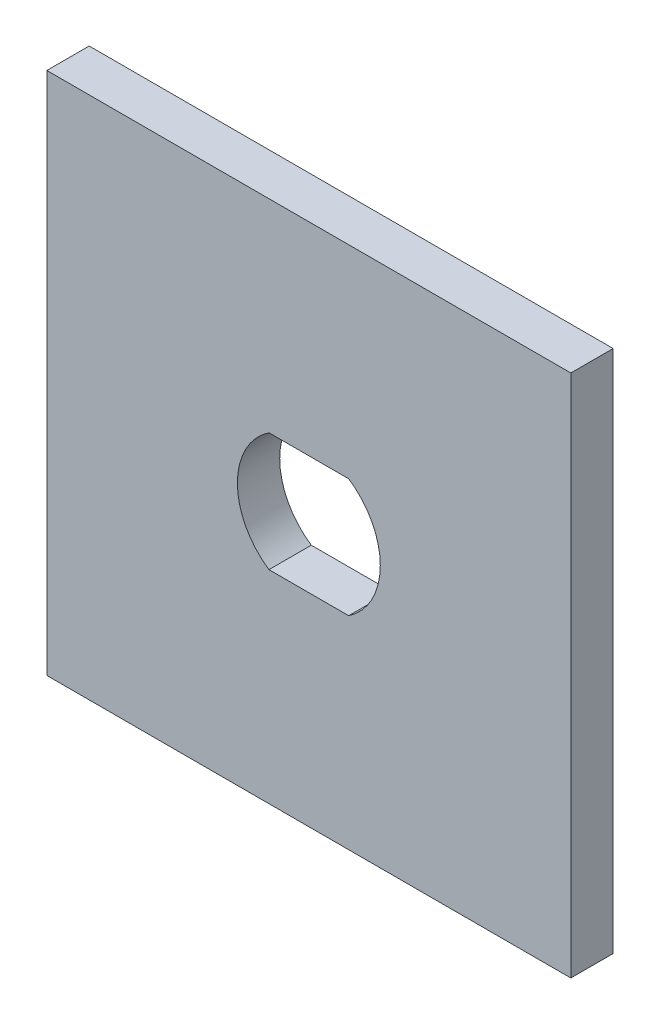
ISO-10303-21;
HEADER;
FILE_DESCRIPTION(('STEP AP214'),'2;1');
FILE_NAME('part.step','',(''),(''),'','','');
FILE_SCHEMA(('AUTOMOTIVE_DESIGN { 1 0 10303 214 1 1 1 1 }'));
ENDSEC;
DATA;
#1=APPLICATION_CONTEXT('core data for automotive mechanical design processes');
#2=APPLICATION_PROTOCOL_DEFINITION('international standard','automotive_design',2000,#1);
#3=PRODUCT_CONTEXT('',#1,'mechanical');
#4=PRODUCT('Part','Part','',(#3));
#5=PRODUCT_RELATED_PRODUCT_CATEGORY('part','',(#4));
#6=PRODUCT_DEFINITION_FORMATION('','',#4);
#7=PRODUCT_DEFINITION_CONTEXT('part definition',#1,'design');
#8=PRODUCT_DEFINITION('design','',#6,#7);
#9=PRODUCT_DEFINITION_SHAPE('','',#8);
#10=(LENGTH_UNIT() NAMED_UNIT(*) SI_UNIT(.MILLI.,.METRE.));
#11=(NAMED_UNIT(*) PLANE_ANGLE_UNIT() SI_UNIT($,.RADIAN.));
#12=(NAMED_UNIT(*) SI_UNIT($,.STERADIAN.) SOLID_ANGLE_UNIT());
#13=UNCERTAINTY_MEASURE_WITH_UNIT(LENGTH_MEASURE(1.E-05),#10,'distance_accuracy_value','');
#14=(GEOMETRIC_REPRESENTATION_CONTEXT(3) GLOBAL_UNCERTAINTY_ASSIGNED_CONTEXT((#13)) GLOBAL_UNIT_ASSIGNED_CONTEXT((#10,
#11,#12)) REPRESENTATION_CONTEXT('',''));
#15=CARTESIAN_POINT('',(0.,0.,0.));
#16=DIRECTION('',(0.,0.,1.));
#17=DIRECTION('',(1.,0.,0.));
#18=AXIS2_PLACEMENT_3D('',#15,#16,#17);
#19=CARTESIAN_POINT('',(-0.019537909709249,0.00220515510876755,7.89227105759841));
#20=DIRECTION('',(0.,0.,-1.));
#21=DIRECTION('',(-1.,0.,0.));
#22=AXIS2_PLACEMENT_3D('',#19,#20,#21);
#23=PLANE('',#22);
#24=DIRECTION('',(0.,-1.,0.));
#25=VECTOR('',#24,1.);
#26=CARTESIAN_POINT('',(24.7304620902908,24.7522051551088,7.89227105759841));
#27=LINE('',#26,#25);
#28=CARTESIAN_POINT('',(24.7304620902908,24.7522051551088,7.89227105759841));
#29=VERTEX_POINT('',#28);
#30=CARTESIAN_POINT('',(24.7304620902908,-24.7477948448912,7.89227105759841));
#31=VERTEX_POINT('',#30);
#32=EDGE_CURVE('E116',#29,#31,#27,.T.);
#33=ORIENTED_EDGE('',*,*,#32,.F.);
#34=DIRECTION('',(1.,0.,0.));
#35=VECTOR('',#34,1.);
#36=CARTESIAN_POINT('',(-24.7695379097092,24.7522051551088,7.89227105759841));
#37=LINE('',#36,#35);
#38=CARTESIAN_POINT('',(-24.7695379097092,24.7522051551088,7.89227105759841));
#39=VERTEX_POINT('',#38);
#40=EDGE_CURVE('E36',#39,#29,#37,.T.);
#41=ORIENTED_EDGE('',*,*,#40,.F.);
#42=DIRECTION('',(0.,1.,0.));
#43=VECTOR('',#42,1.);
#44=CARTESIAN_POINT('',(-24.7695379097093,-24.7477948448912,7.89227105759841));
#45=LINE('',#44,#43);
#46=CARTESIAN_POINT('',(-24.7695379097093,-24.7477948448912,7.89227105759841));
#47=VERTEX_POINT('',#46);
#48=EDGE_CURVE('E127',#47,#39,#45,.T.);
#49=ORIENTED_EDGE('',*,*,#48,.F.);
#50=DIRECTION('',(-1.,0.,0.));
#51=VECTOR('',#50,1.);
#52=CARTESIAN_POINT('',(24.7304620902908,-24.7477948448912,7.89227105759841));
#53=LINE('',#52,#51);
#54=EDGE_CURVE('E27',#31,#47,#53,.T.);
#55=ORIENTED_EDGE('',*,*,#54,.F.);
#56=EDGE_LOOP('',(#33,#41,#49,#55));
#57=FACE_BOUND('',#56,.T.);
#58=CARTESIAN_POINT('',(-0.019537909709249,0.00220515510876755,7.89227105759841));
#59=DIRECTION('',(0.,0.,1.));
#60=DIRECTION('',(0.558314138850714,-0.829629629629623,0.));
#61=AXIS2_PLACEMENT_3D('',#58,#59,#60);
#62=CIRCLE('',#61,6.75);
#63=CARTESIAN_POINT('',(3.74908252753275,-5.59779484489124,7.89227105759841));
#64=VERTEX_POINT('',#63);
#65=CARTESIAN_POINT('',(3.74908252753275,5.60220515510877,7.89227105759841));
#66=VERTEX_POINT('',#65);
#67=EDGE_CURVE('E110',#64,#66,#62,.T.);
#68=ORIENTED_EDGE('',*,*,#67,.F.);
#69=DIRECTION('',(1.,0.,0.));
#70=VECTOR('',#69,1.);
#71=CARTESIAN_POINT('',(-3.78815834695126,-5.59779484489124,7.89227105759841));
#72=LINE('',#71,#70);
#73=CARTESIAN_POINT('',(-3.78815834695126,-5.59779484489124,7.89227105759841));
#74=VERTEX_POINT('',#73);
#75=EDGE_CURVE('E103',#74,#64,#72,.T.);
#76=ORIENTED_EDGE('',*,*,#75,.F.);
#77=CARTESIAN_POINT('',(-0.019537909709249,0.00220515510876755,7.89227105759841));
#78=DIRECTION('',(0.,0.,1.));
#79=DIRECTION('',(-0.558314138850714,0.829629629629623,0.));
#80=AXIS2_PLACEMENT_3D('',#77,#78,#79);
#81=CIRCLE('',#80,6.75);
#82=CARTESIAN_POINT('',(-3.78815834695125,5.60220515510878,7.89227105759841));
#83=VERTEX_POINT('',#82);
#84=EDGE_CURVE('E101',#83,#74,#81,.T.);
#85=ORIENTED_EDGE('',*,*,#84,.F.);
#86=DIRECTION('',(-1.,0.,0.));
#87=VECTOR('',#86,1.);
#88=CARTESIAN_POINT('',(3.74908252753275,5.60220515510877,7.89227105759841));
#89=LINE('',#88,#87);
#90=EDGE_CURVE('E107',#66,#83,#89,.T.);
#91=ORIENTED_EDGE('',*,*,#90,.F.);
#92=EDGE_LOOP('',(#68,#76,#85,#91));
#93=FACE_BOUND('',#92,.T.);
#94=ADVANCED_FACE('F17',(#57,#93),#23,.F.);
#95=CARTESIAN_POINT('',(24.7304620902908,-24.7477948448912,7.89227105759841));
#96=DIRECTION('',(0.,-1.,0.));
#97=DIRECTION('',(-1.,0.,0.));
#98=AXIS2_PLACEMENT_3D('',#95,#96,#97);
#99=PLANE('',#98);
#100=DIRECTION('',(0.,0.,-1.));
#101=VECTOR('',#100,1.);
#102=CARTESIAN_POINT('',(-24.7695379097093,-24.7477948448912,7.89227105759841));
#103=LINE('',#102,#101);
#104=CARTESIAN_POINT('',(-24.7695379097093,-24.7477948448912,3.8922710575984));
#105=VERTEX_POINT('',#104);
#106=EDGE_CURVE('E11',#47,#105,#103,.T.);
#107=ORIENTED_EDGE('',*,*,#106,.T.);
#108=DIRECTION('',(-1.,0.,0.));
#109=VECTOR('',#108,1.);
#110=CARTESIAN_POINT('',(24.7304620902908,-24.7477948448912,3.8922710575984));
#111=LINE('',#110,#109);
#112=CARTESIAN_POINT('',(24.7304620902908,-24.7477948448912,3.8922710575984));
#113=VERTEX_POINT('',#112);
#114=EDGE_CURVE('E99',#113,#105,#111,.T.);
#115=ORIENTED_EDGE('',*,*,#114,.F.);
#116=DIRECTION('',(0.,0.,-1.));
#117=VECTOR('',#116,1.);
#118=CARTESIAN_POINT('',(24.7304620902908,-24.7477948448912,7.89227105759841));
#119=LINE('',#118,#117);
#120=EDGE_CURVE('E113',#31,#113,#119,.T.);
#121=ORIENTED_EDGE('',*,*,#120,.F.);
#122=ORIENTED_EDGE('',*,*,#54,.T.);
#123=EDGE_LOOP('',(#107,#115,#121,#122));
#124=FACE_BOUND('',#123,.T.);
#125=ADVANCED_FACE('F154',(#124),#99,.T.);
#126=CARTESIAN_POINT('',(24.7304620902908,24.7522051551088,7.89227105759841));
#127=DIRECTION('',(1.,0.,0.));
#128=DIRECTION('',(0.,-1.,0.));
#129=AXIS2_PLACEMENT_3D('',#126,#127,#128);
#130=PLANE('',#129);
#131=ORIENTED_EDGE('',*,*,#120,.T.);
#132=DIRECTION('',(0.,-1.,0.));
#133=VECTOR('',#132,1.);
#134=CARTESIAN_POINT('',(24.7304620902908,24.7522051551088,3.8922710575984));
#135=LINE('',#134,#133);
#136=CARTESIAN_POINT('',(24.7304620902908,24.7522051551088,3.8922710575984));
#137=VERTEX_POINT('',#136);
#138=EDGE_CURVE('E117',#137,#113,#135,.T.);
#139=ORIENTED_EDGE('',*,*,#138,.F.);
#140=DIRECTION('',(0.,0.,-1.));
#141=VECTOR('',#140,1.);
#142=CARTESIAN_POINT('',(24.7304620902908,24.7522051551088,7.89227105759841));
#143=LINE('',#142,#141);
#144=EDGE_CURVE('E119',#29,#137,#143,.T.);
#145=ORIENTED_EDGE('',*,*,#144,.F.);
#146=ORIENTED_EDGE('',*,*,#32,.T.);
#147=EDGE_LOOP('',(#131,#139,#145,#146));
#148=FACE_BOUND('',#147,.T.);
#149=ADVANCED_FACE('F160',(#148),#130,.T.);
#150=CARTESIAN_POINT('',(-24.7695379097092,24.7522051551088,7.89227105759841));
#151=DIRECTION('',(0.,1.,0.));
#152=DIRECTION('',(1.,0.,0.));
#153=AXIS2_PLACEMENT_3D('',#150,#151,#152);
#154=PLANE('',#153);
#155=ORIENTED_EDGE('',*,*,#144,.T.);
#156=DIRECTION('',(1.,0.,0.));
#157=VECTOR('',#156,1.);
#158=CARTESIAN_POINT('',(-24.7695379097092,24.7522051551088,3.8922710575984));
#159=LINE('',#158,#157);
#160=CARTESIAN_POINT('',(-24.7695379097092,24.7522051551088,3.8922710575984));
#161=VERTEX_POINT('',#160);
#162=EDGE_CURVE('E123',#161,#137,#159,.T.);
#163=ORIENTED_EDGE('',*,*,#162,.F.);
#164=DIRECTION('',(0.,0.,-1.));
#165=VECTOR('',#164,1.);
#166=CARTESIAN_POINT('',(-24.7695379097092,24.7522051551088,7.89227105759841));
#167=LINE('',#166,#165);
#168=EDGE_CURVE('E124',#39,#161,#167,.T.);
#169=ORIENTED_EDGE('',*,*,#168,.F.);
#170=ORIENTED_EDGE('',*,*,#40,.T.);
#171=EDGE_LOOP('',(#155,#163,#169,#170));
#172=FACE_BOUND('',#171,.T.);
#173=ADVANCED_FACE('F166',(#172),#154,.T.);
#174=CARTESIAN_POINT('',(-24.7695379097093,-24.7477948448912,7.89227105759841));
#175=DIRECTION('',(-1.,0.,0.));
#176=DIRECTION('',(0.,1.,0.));
#177=AXIS2_PLACEMENT_3D('',#174,#175,#176);
#178=PLANE('',#177);
#179=ORIENTED_EDGE('',*,*,#168,.T.);
#180=DIRECTION('',(0.,1.,0.));
#181=VECTOR('',#180,1.);
#182=CARTESIAN_POINT('',(-24.7695379097093,-24.7477948448912,3.8922710575984));
#183=LINE('',#182,#181);
#184=EDGE_CURVE('E130',#105,#161,#183,.T.);
#185=ORIENTED_EDGE('',*,*,#184,.F.);
#186=ORIENTED_EDGE('',*,*,#106,.F.);
#187=ORIENTED_EDGE('',*,*,#48,.T.);
#188=EDGE_LOOP('',(#179,#185,#186,#187));
#189=FACE_BOUND('',#188,.T.);
#190=ADVANCED_FACE('F170',(#189),#178,.T.);
#191=CARTESIAN_POINT('',(-0.019537909709249,0.00220515510876755,3.8922710575984));
#192=DIRECTION('',(0.,0.,-1.));
#193=DIRECTION('',(-1.,0.,0.));
#194=AXIS2_PLACEMENT_3D('',#191,#192,#193);
#195=PLANE('',#194);
#196=ORIENTED_EDGE('',*,*,#184,.T.);
#197=ORIENTED_EDGE('',*,*,#162,.T.);
#198=ORIENTED_EDGE('',*,*,#138,.T.);
#199=ORIENTED_EDGE('',*,*,#114,.T.);
#200=EDGE_LOOP('',(#196,#197,#198,#199));
#201=FACE_BOUND('',#200,.T.);
#202=CARTESIAN_POINT('',(-0.019537909709249,0.00220515510876755,3.8922710575984));
#203=DIRECTION('',(0.,0.,1.));
#204=DIRECTION('',(-0.558314138850714,0.829629629629623,0.));
#205=AXIS2_PLACEMENT_3D('',#202,#203,#204);
#206=CIRCLE('',#205,6.75);
#207=CARTESIAN_POINT('',(-3.78815834695125,5.60220515510878,3.8922710575984));
#208=VERTEX_POINT('',#207);
#209=CARTESIAN_POINT('',(-3.78815834695126,-5.59779484489124,3.8922710575984));
#210=VERTEX_POINT('',#209);
#211=EDGE_CURVE('E91',#208,#210,#206,.T.);
#212=ORIENTED_EDGE('',*,*,#211,.T.);
#213=DIRECTION('',(1.,0.,0.));
#214=VECTOR('',#213,1.);
#215=CARTESIAN_POINT('',(-3.78815834695126,-5.59779484489124,3.8922710575984));
#216=LINE('',#215,#214);
#217=CARTESIAN_POINT('',(3.74908252753275,-5.59779484489124,3.8922710575984));
#218=VERTEX_POINT('',#217);
#219=EDGE_CURVE('E85',#210,#218,#216,.T.);
#220=ORIENTED_EDGE('',*,*,#219,.T.);
#221=CARTESIAN_POINT('',(-0.019537909709249,0.00220515510876755,3.8922710575984));
#222=DIRECTION('',(0.,0.,1.));
#223=DIRECTION('',(0.558314138850714,-0.829629629629623,0.));
#224=AXIS2_PLACEMENT_3D('',#221,#222,#223);
#225=CIRCLE('',#224,6.75);
#226=CARTESIAN_POINT('',(3.74908252753275,5.60220515510877,3.8922710575984));
#227=VERTEX_POINT('',#226);
#228=EDGE_CURVE('E79',#218,#227,#225,.T.);
#229=ORIENTED_EDGE('',*,*,#228,.T.);
#230=DIRECTION('',(-1.,0.,0.));
#231=VECTOR('',#230,1.);
#232=CARTESIAN_POINT('',(3.74908252753275,5.60220515510877,3.8922710575984));
#233=LINE('',#232,#231);
#234=EDGE_CURVE('E95',#227,#208,#233,.T.);
#235=ORIENTED_EDGE('',*,*,#234,.T.);
#236=EDGE_LOOP('',(#212,#220,#229,#235));
#237=FACE_BOUND('',#236,.T.);
#238=ADVANCED_FACE('F94',(#201,#237),#195,.T.);
#239=CARTESIAN_POINT('',(3.74908252753275,5.60220515510877,7.89227105759841));
#240=DIRECTION('',(0.,-1.,0.));
#241=DIRECTION('',(-1.,0.,0.));
#242=AXIS2_PLACEMENT_3D('',#239,#240,#241);
#243=PLANE('',#242);
#244=DIRECTION('',(0.,0.,-1.));
#245=VECTOR('',#244,1.);
#246=CARTESIAN_POINT('',(-3.78815834695125,5.60220515510878,7.89227105759841));
#247=LINE('',#246,#245);
#248=EDGE_CURVE('E134',#83,#208,#247,.T.);
#249=ORIENTED_EDGE('',*,*,#248,.T.);
#250=ORIENTED_EDGE('',*,*,#234,.F.);
#251=DIRECTION('',(0.,0.,-1.));
#252=VECTOR('',#251,1.);
#253=CARTESIAN_POINT('',(3.74908252753275,5.60220515510877,7.89227105759841));
#254=LINE('',#253,#252);
#255=EDGE_CURVE('E112',#66,#227,#254,.T.);
#256=ORIENTED_EDGE('',*,*,#255,.F.);
#257=ORIENTED_EDGE('',*,*,#90,.T.);
#258=EDGE_LOOP('',(#249,#250,#256,#257));
#259=FACE_BOUND('',#258,.T.);
#260=ADVANCED_FACE('F141',(#259),#243,.T.);
#261=CARTESIAN_POINT('',(-0.019537909709249,0.00220515510876755,7.89227105759841));
#262=DIRECTION('',(0.,0.,-1.));
#263=DIRECTION('',(-1.,0.,0.));
#264=AXIS2_PLACEMENT_3D('',#261,#262,#263);
#265=CYLINDRICAL_SURFACE('',#264,6.75);
#266=ORIENTED_EDGE('',*,*,#255,.T.);
#267=ORIENTED_EDGE('',*,*,#228,.F.);
#268=DIRECTION('',(0.,0.,-1.));
#269=VECTOR('',#268,1.);
#270=CARTESIAN_POINT('',(3.74908252753275,-5.59779484489124,7.89227105759841));
#271=LINE('',#270,#269);
#272=EDGE_CURVE('E89',#64,#218,#271,.T.);
#273=ORIENTED_EDGE('',*,*,#272,.F.);
#274=ORIENTED_EDGE('',*,*,#67,.T.);
#275=EDGE_LOOP('',(#266,#267,#273,#274));
#276=FACE_BOUND('',#275,.T.);
#277=ADVANCED_FACE('F144',(#276),#265,.F.);
#278=CARTESIAN_POINT('',(-3.78815834695126,-5.59779484489124,7.89227105759841));
#279=DIRECTION('',(0.,1.,0.));
#280=DIRECTION('',(1.,0.,0.));
#281=AXIS2_PLACEMENT_3D('',#278,#279,#280);
#282=PLANE('',#281);
#283=ORIENTED_EDGE('',*,*,#272,.T.);
#284=ORIENTED_EDGE('',*,*,#219,.F.);
#285=DIRECTION('',(0.,0.,-1.));
#286=VECTOR('',#285,1.);
#287=CARTESIAN_POINT('',(-3.78815834695126,-5.59779484489124,7.89227105759841));
#288=LINE('',#287,#286);
#289=EDGE_CURVE('E21',#74,#210,#288,.T.);
#290=ORIENTED_EDGE('',*,*,#289,.F.);
#291=ORIENTED_EDGE('',*,*,#75,.T.);
#292=EDGE_LOOP('',(#283,#284,#290,#291));
#293=FACE_BOUND('',#292,.T.);
#294=ADVANCED_FACE('F87',(#293),#282,.T.);
#295=CARTESIAN_POINT('',(-0.019537909709249,0.00220515510876755,7.89227105759841));
#296=DIRECTION('',(0.,0.,-1.));
#297=DIRECTION('',(-1.,0.,0.));
#298=AXIS2_PLACEMENT_3D('',#295,#296,#297);
#299=CYLINDRICAL_SURFACE('',#298,6.75);
#300=ORIENTED_EDGE('',*,*,#289,.T.);
#301=ORIENTED_EDGE('',*,*,#211,.F.);
#302=ORIENTED_EDGE('',*,*,#248,.F.);
#303=ORIENTED_EDGE('',*,*,#84,.T.);
#304=EDGE_LOOP('',(#300,#301,#302,#303));
#305=FACE_BOUND('',#304,.T.);
#306=ADVANCED_FACE('F19',(#305),#299,.F.);
#307=CLOSED_SHELL('',(#94,#125,#149,#173,#190,#238,#260,#277,#294,#306));
#308=MANIFOLD_SOLID_BREP('B1',#307);
#309=ADVANCED_BREP_SHAPE_REPRESENTATION('',(#18,#308),#14);
#310=SHAPE_DEFINITION_REPRESENTATION(#9,#309);
ENDSEC;
END-ISO-10303-21;
